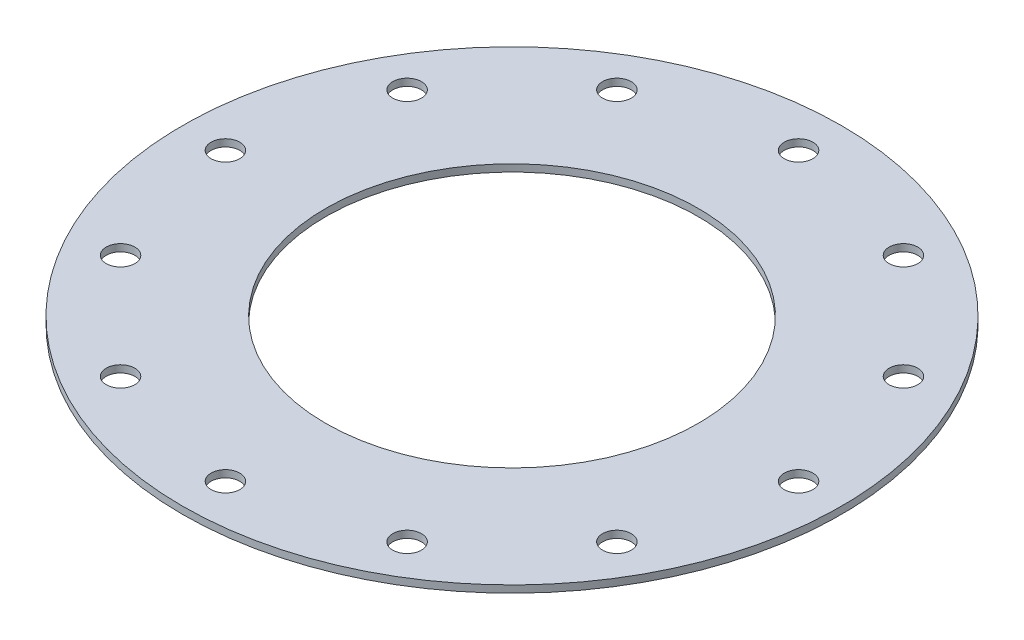
ISO-10303-21;
HEADER;
FILE_DESCRIPTION(('STEP AP214'),'2;1');
FILE_NAME('part.step','',(''),(''),'','','');
FILE_SCHEMA(('AUTOMOTIVE_DESIGN { 1 0 10303 214 1 1 1 1 }'));
ENDSEC;
DATA;
#1=APPLICATION_CONTEXT('core data for automotive mechanical design processes');
#2=APPLICATION_PROTOCOL_DEFINITION('international standard','automotive_design',2000,#1);
#3=PRODUCT_CONTEXT('',#1,'mechanical');
#4=PRODUCT('Part','Part','',(#3));
#5=PRODUCT_RELATED_PRODUCT_CATEGORY('part','',(#4));
#6=PRODUCT_DEFINITION_FORMATION('','',#4);
#7=PRODUCT_DEFINITION_CONTEXT('part definition',#1,'design');
#8=PRODUCT_DEFINITION('design','',#6,#7);
#9=PRODUCT_DEFINITION_SHAPE('','',#8);
#10=(LENGTH_UNIT() NAMED_UNIT(*) SI_UNIT(.MILLI.,.METRE.));
#11=(NAMED_UNIT(*) PLANE_ANGLE_UNIT() SI_UNIT($,.RADIAN.));
#12=(NAMED_UNIT(*) SI_UNIT($,.STERADIAN.) SOLID_ANGLE_UNIT());
#13=UNCERTAINTY_MEASURE_WITH_UNIT(LENGTH_MEASURE(1.E-05),#10,'distance_accuracy_value','');
#14=(GEOMETRIC_REPRESENTATION_CONTEXT(3) GLOBAL_UNCERTAINTY_ASSIGNED_CONTEXT((#13)) GLOBAL_UNIT_ASSIGNED_CONTEXT((#10,
#11,#12)) REPRESENTATION_CONTEXT('',''));
#15=CARTESIAN_POINT('',(0.,0.,0.));
#16=DIRECTION('',(0.,0.,1.));
#17=DIRECTION('',(1.,0.,0.));
#18=AXIS2_PLACEMENT_3D('',#15,#16,#17);
#19=CARTESIAN_POINT('',(0.,2.5,0.));
#20=DIRECTION('',(0.,1.,0.));
#21=DIRECTION('',(0.,0.,1.));
#22=AXIS2_PLACEMENT_3D('',#19,#20,#21);
#23=PLANE('',#22);
#24=CARTESIAN_POINT('',(-86.6025403784418,2.5,-49.9999999999963));
#25=DIRECTION('',(0.,1.,0.));
#26=DIRECTION('',(0.,0.,1.));
#27=AXIS2_PLACEMENT_3D('',#24,#25,#26);
#28=CIRCLE('',#27,5.0000000000043);
#29=CARTESIAN_POINT('',(-86.6025403784418,2.5,-44.9999999999919));
#30=VERTEX_POINT('',#29);
#31=EDGE_CURVE('E107',#30,#30,#28,.T.);
#32=ORIENTED_EDGE('',*,*,#31,.F.);
#33=EDGE_LOOP('',(#32));
#34=FACE_BOUND('',#33,.T.);
#35=CARTESIAN_POINT('',(-86.6025403784375,2.5,50.0000000000037));
#36=DIRECTION('',(0.,1.,0.));
#37=DIRECTION('',(0.,0.,1.));
#38=AXIS2_PLACEMENT_3D('',#35,#36,#37);
#39=CIRCLE('',#38,5.00000000000811);
#40=CARTESIAN_POINT('',(-86.6025403784375,2.5,55.0000000000118));
#41=VERTEX_POINT('',#40);
#42=EDGE_CURVE('E95',#41,#41,#39,.T.);
#43=ORIENTED_EDGE('',*,*,#42,.F.);
#44=EDGE_LOOP('',(#43));
#45=FACE_BOUND('',#44,.T.);
#46=CARTESIAN_POINT('',(8.50201989313826E-12,2.5,100.));
#47=DIRECTION('',(0.,1.,0.));
#48=DIRECTION('',(0.,0.,1.));
#49=AXIS2_PLACEMENT_3D('',#46,#47,#48);
#50=CIRCLE('',#49,5.0000000000088);
#51=CARTESIAN_POINT('',(8.50201989313826E-12,2.5,105.000000000009));
#52=VERTEX_POINT('',#51);
#53=EDGE_CURVE('E83',#52,#52,#50,.T.);
#54=ORIENTED_EDGE('',*,*,#53,.F.);
#55=EDGE_LOOP('',(#54));
#56=FACE_BOUND('',#55,.T.);
#57=CARTESIAN_POINT('',(86.6025403784503,2.5,49.9999999999963));
#58=DIRECTION('',(0.,1.,0.));
#59=DIRECTION('',(0.,0.,1.));
#60=AXIS2_PLACEMENT_3D('',#57,#58,#59);
#61=CIRCLE('',#60,5.00000000000549);
#62=CARTESIAN_POINT('',(86.6025403784503,2.5,55.0000000000018));
#63=VERTEX_POINT('',#62);
#64=EDGE_CURVE('E71',#63,#63,#61,.T.);
#65=ORIENTED_EDGE('',*,*,#64,.F.);
#66=EDGE_LOOP('',(#65));
#67=FACE_BOUND('',#66,.T.);
#68=CARTESIAN_POINT('',(86.602540378446,2.5,-50.0000000000037));
#69=DIRECTION('',(0.,1.,0.));
#70=DIRECTION('',(0.,0.,1.));
#71=AXIS2_PLACEMENT_3D('',#68,#69,#70);
#72=CIRCLE('',#71,5.00000000000119);
#73=CARTESIAN_POINT('',(86.602540378446,2.5,-45.0000000000025));
#74=VERTEX_POINT('',#73);
#75=EDGE_CURVE('E59',#74,#74,#72,.T.);
#76=ORIENTED_EDGE('',*,*,#75,.F.);
#77=EDGE_LOOP('',(#76));
#78=FACE_BOUND('',#77,.T.);
#79=CARTESIAN_POINT('',(0.,2.5,0.));
#80=DIRECTION('',(0.,1.,0.));
#81=DIRECTION('',(0.,0.,1.));
#82=AXIS2_PLACEMENT_3D('',#79,#80,#81);
#83=CIRCLE('',#82,65.);
#84=CARTESIAN_POINT('',(0.,2.5,65.));
#85=VERTEX_POINT('',#84);
#86=EDGE_CURVE('E47',#85,#85,#83,.T.);
#87=ORIENTED_EDGE('',*,*,#86,.F.);
#88=EDGE_LOOP('',(#87));
#89=FACE_BOUND('',#88,.T.);
#90=CARTESIAN_POINT('',(0.,2.5,0.));
#91=DIRECTION('',(0.,1.,0.));
#92=DIRECTION('',(0.,0.,1.));
#93=AXIS2_PLACEMENT_3D('',#90,#91,#92);
#94=CIRCLE('',#93,115.);
#95=CARTESIAN_POINT('',(0.,2.5,115.));
#96=VERTEX_POINT('',#95);
#97=EDGE_CURVE('E10',#96,#96,#94,.T.);
#98=ORIENTED_EDGE('',*,*,#97,.T.);
#99=EDGE_LOOP('',(#98));
#100=FACE_BOUND('',#99,.T.);
#101=CARTESIAN_POINT('',(0.,2.5,-100.));
#102=DIRECTION('',(0.,1.,0.));
#103=DIRECTION('',(0.,0.,1.));
#104=AXIS2_PLACEMENT_3D('',#101,#102,#103);
#105=CIRCLE('',#104,5.);
#106=CARTESIAN_POINT('',(0.,2.5,-95.));
#107=VERTEX_POINT('',#106);
#108=EDGE_CURVE('E42',#107,#107,#105,.T.);
#109=ORIENTED_EDGE('',*,*,#108,.F.);
#110=EDGE_LOOP('',(#109));
#111=FACE_BOUND('',#110,.T.);
#112=CARTESIAN_POINT('',(50.0000000000001,2.5,-86.6025403784438));
#113=DIRECTION('',(0.,1.,0.));
#114=DIRECTION('',(0.,0.,1.));
#115=AXIS2_PLACEMENT_3D('',#112,#113,#114);
#116=CIRCLE('',#115,5.00000000000001);
#117=CARTESIAN_POINT('',(50.0000000000001,2.5,-81.6025403784438));
#118=VERTEX_POINT('',#117);
#119=EDGE_CURVE('E53',#118,#118,#116,.T.);
#120=ORIENTED_EDGE('',*,*,#119,.F.);
#121=EDGE_LOOP('',(#120));
#122=FACE_BOUND('',#121,.T.);
#123=CARTESIAN_POINT('',(100.000000000004,2.5,-4.25100994656913E-12));
#124=DIRECTION('',(0.,1.,0.));
#125=DIRECTION('',(0.,0.,1.));
#126=AXIS2_PLACEMENT_3D('',#123,#124,#125);
#127=CIRCLE('',#126,5.00000000000316);
#128=CARTESIAN_POINT('',(100.000000000004,2.5,4.99999999999891));
#129=VERTEX_POINT('',#128);
#130=EDGE_CURVE('E65',#129,#129,#127,.T.);
#131=ORIENTED_EDGE('',*,*,#130,.F.);
#132=EDGE_LOOP('',(#131));
#133=FACE_BOUND('',#132,.T.);
#134=CARTESIAN_POINT('',(50.000000000008,2.5,86.6025403784417));
#135=DIRECTION('',(0.,1.,0.));
#136=DIRECTION('',(0.,0.,1.));
#137=AXIS2_PLACEMENT_3D('',#134,#135,#136);
#138=CIRCLE('',#137,5.00000000000758);
#139=CARTESIAN_POINT('',(50.000000000008,2.5,91.6025403784493));
#140=VERTEX_POINT('',#139);
#141=EDGE_CURVE('E77',#140,#140,#138,.T.);
#142=ORIENTED_EDGE('',*,*,#141,.F.);
#143=EDGE_LOOP('',(#142));
#144=FACE_BOUND('',#143,.T.);
#145=CARTESIAN_POINT('',(-49.999999999992,2.5,86.602540378446));
#146=DIRECTION('',(0.,1.,0.));
#147=DIRECTION('',(0.,0.,1.));
#148=AXIS2_PLACEMENT_3D('',#145,#146,#147);
#149=CIRCLE('',#148,5.00000000000902);
#150=CARTESIAN_POINT('',(-49.999999999992,2.5,91.602540378455));
#151=VERTEX_POINT('',#150);
#152=EDGE_CURVE('E89',#151,#151,#149,.T.);
#153=ORIENTED_EDGE('',*,*,#152,.F.);
#154=EDGE_LOOP('',(#153));
#155=FACE_BOUND('',#154,.T.);
#156=CARTESIAN_POINT('',(-99.9999999999958,2.5,4.2632564145606E-12));
#157=DIRECTION('',(0.,1.,0.));
#158=DIRECTION('',(0.,0.,1.));
#159=AXIS2_PLACEMENT_3D('',#156,#157,#158);
#160=CIRCLE('',#159,5.00000000000632);
#161=CARTESIAN_POINT('',(-99.9999999999958,2.5,5.00000000001058));
#162=VERTEX_POINT('',#161);
#163=EDGE_CURVE('E101',#162,#162,#160,.T.);
#164=ORIENTED_EDGE('',*,*,#163,.F.);
#165=EDGE_LOOP('',(#164));
#166=FACE_BOUND('',#165,.T.);
#167=CARTESIAN_POINT('',(-49.9999999999995,2.5,-86.6025403784417));
#168=DIRECTION('',(0.,1.,0.));
#169=DIRECTION('',(0.,0.,1.));
#170=AXIS2_PLACEMENT_3D('',#167,#168,#169);
#171=CIRCLE('',#170,5.00000000000245);
#172=CARTESIAN_POINT('',(-49.9999999999995,2.5,-81.6025403784393));
#173=VERTEX_POINT('',#172);
#174=EDGE_CURVE('E113',#173,#173,#171,.T.);
#175=ORIENTED_EDGE('',*,*,#174,.F.);
#176=EDGE_LOOP('',(#175));
#177=FACE_BOUND('',#176,.T.);
#178=ADVANCED_FACE('F31',(#34,#45,#56,#67,#78,#89,#100,#111,#122,#133,#144,#155,#166,#177),#23,.T.);
#179=CARTESIAN_POINT('',(0.,0.,0.));
#180=DIRECTION('',(0.,1.,0.));
#181=DIRECTION('',(0.,0.,1.));
#182=AXIS2_PLACEMENT_3D('',#179,#180,#181);
#183=PLANE('',#182);
#184=CARTESIAN_POINT('',(0.,0.,0.));
#185=DIRECTION('',(0.,1.,0.));
#186=DIRECTION('',(0.,0.,1.));
#187=AXIS2_PLACEMENT_3D('',#184,#185,#186);
#188=CIRCLE('',#187,115.);
#189=CARTESIAN_POINT('',(0.,0.,115.));
#190=VERTEX_POINT('',#189);
#191=EDGE_CURVE('E35',#190,#190,#188,.T.);
#192=ORIENTED_EDGE('',*,*,#191,.F.);
#193=EDGE_LOOP('',(#192));
#194=FACE_BOUND('',#193,.T.);
#195=CARTESIAN_POINT('',(0.,0.,-100.));
#196=DIRECTION('',(0.,1.,0.));
#197=DIRECTION('',(0.,0.,1.));
#198=AXIS2_PLACEMENT_3D('',#195,#196,#197);
#199=CIRCLE('',#198,5.);
#200=CARTESIAN_POINT('',(0.,0.,-95.));
#201=VERTEX_POINT('',#200);
#202=EDGE_CURVE('E44',#201,#201,#199,.T.);
#203=ORIENTED_EDGE('',*,*,#202,.T.);
#204=EDGE_LOOP('',(#203));
#205=FACE_BOUND('',#204,.T.);
#206=CARTESIAN_POINT('',(0.,0.,0.));
#207=DIRECTION('',(0.,1.,0.));
#208=DIRECTION('',(0.,0.,1.));
#209=AXIS2_PLACEMENT_3D('',#206,#207,#208);
#210=CIRCLE('',#209,65.);
#211=CARTESIAN_POINT('',(0.,0.,65.));
#212=VERTEX_POINT('',#211);
#213=EDGE_CURVE('E50',#212,#212,#210,.T.);
#214=ORIENTED_EDGE('',*,*,#213,.T.);
#215=EDGE_LOOP('',(#214));
#216=FACE_BOUND('',#215,.T.);
#217=CARTESIAN_POINT('',(50.0000000000001,0.,-86.6025403784438));
#218=DIRECTION('',(0.,1.,0.));
#219=DIRECTION('',(0.,0.,1.));
#220=AXIS2_PLACEMENT_3D('',#217,#218,#219);
#221=CIRCLE('',#220,5.00000000000001);
#222=CARTESIAN_POINT('',(50.0000000000001,0.,-81.6025403784438));
#223=VERTEX_POINT('',#222);
#224=EDGE_CURVE('E56',#223,#223,#221,.T.);
#225=ORIENTED_EDGE('',*,*,#224,.T.);
#226=EDGE_LOOP('',(#225));
#227=FACE_BOUND('',#226,.T.);
#228=CARTESIAN_POINT('',(86.602540378446,0.,-50.0000000000037));
#229=DIRECTION('',(0.,1.,0.));
#230=DIRECTION('',(0.,0.,1.));
#231=AXIS2_PLACEMENT_3D('',#228,#229,#230);
#232=CIRCLE('',#231,5.00000000000119);
#233=CARTESIAN_POINT('',(86.602540378446,0.,-45.0000000000025));
#234=VERTEX_POINT('',#233);
#235=EDGE_CURVE('E62',#234,#234,#232,.T.);
#236=ORIENTED_EDGE('',*,*,#235,.T.);
#237=EDGE_LOOP('',(#236));
#238=FACE_BOUND('',#237,.T.);
#239=CARTESIAN_POINT('',(100.000000000004,0.,-4.25100994656913E-12));
#240=DIRECTION('',(0.,1.,0.));
#241=DIRECTION('',(0.,0.,1.));
#242=AXIS2_PLACEMENT_3D('',#239,#240,#241);
#243=CIRCLE('',#242,5.00000000000316);
#244=CARTESIAN_POINT('',(100.000000000004,0.,4.99999999999891));
#245=VERTEX_POINT('',#244);
#246=EDGE_CURVE('E68',#245,#245,#243,.T.);
#247=ORIENTED_EDGE('',*,*,#246,.T.);
#248=EDGE_LOOP('',(#247));
#249=FACE_BOUND('',#248,.T.);
#250=CARTESIAN_POINT('',(86.6025403784503,0.,49.9999999999963));
#251=DIRECTION('',(0.,1.,0.));
#252=DIRECTION('',(0.,0.,1.));
#253=AXIS2_PLACEMENT_3D('',#250,#251,#252);
#254=CIRCLE('',#253,5.00000000000549);
#255=CARTESIAN_POINT('',(86.6025403784503,0.,55.0000000000018));
#256=VERTEX_POINT('',#255);
#257=EDGE_CURVE('E74',#256,#256,#254,.T.);
#258=ORIENTED_EDGE('',*,*,#257,.T.);
#259=EDGE_LOOP('',(#258));
#260=FACE_BOUND('',#259,.T.);
#261=CARTESIAN_POINT('',(50.000000000008,0.,86.6025403784417));
#262=DIRECTION('',(0.,1.,0.));
#263=DIRECTION('',(0.,0.,1.));
#264=AXIS2_PLACEMENT_3D('',#261,#262,#263);
#265=CIRCLE('',#264,5.00000000000758);
#266=CARTESIAN_POINT('',(50.000000000008,0.,91.6025403784493));
#267=VERTEX_POINT('',#266);
#268=EDGE_CURVE('E80',#267,#267,#265,.T.);
#269=ORIENTED_EDGE('',*,*,#268,.T.);
#270=EDGE_LOOP('',(#269));
#271=FACE_BOUND('',#270,.T.);
#272=CARTESIAN_POINT('',(8.50201989313826E-12,0.,100.));
#273=DIRECTION('',(0.,1.,0.));
#274=DIRECTION('',(0.,0.,1.));
#275=AXIS2_PLACEMENT_3D('',#272,#273,#274);
#276=CIRCLE('',#275,5.0000000000088);
#277=CARTESIAN_POINT('',(8.50201989313826E-12,0.,105.000000000009));
#278=VERTEX_POINT('',#277);
#279=EDGE_CURVE('E86',#278,#278,#276,.T.);
#280=ORIENTED_EDGE('',*,*,#279,.T.);
#281=EDGE_LOOP('',(#280));
#282=FACE_BOUND('',#281,.T.);
#283=CARTESIAN_POINT('',(-49.999999999992,0.,86.602540378446));
#284=DIRECTION('',(0.,1.,0.));
#285=DIRECTION('',(0.,0.,1.));
#286=AXIS2_PLACEMENT_3D('',#283,#284,#285);
#287=CIRCLE('',#286,5.00000000000902);
#288=CARTESIAN_POINT('',(-49.999999999992,0.,91.602540378455));
#289=VERTEX_POINT('',#288);
#290=EDGE_CURVE('E92',#289,#289,#287,.T.);
#291=ORIENTED_EDGE('',*,*,#290,.T.);
#292=EDGE_LOOP('',(#291));
#293=FACE_BOUND('',#292,.T.);
#294=CARTESIAN_POINT('',(-86.6025403784375,0.,50.0000000000037));
#295=DIRECTION('',(0.,1.,0.));
#296=DIRECTION('',(0.,0.,1.));
#297=AXIS2_PLACEMENT_3D('',#294,#295,#296);
#298=CIRCLE('',#297,5.00000000000811);
#299=CARTESIAN_POINT('',(-86.6025403784375,0.,55.0000000000118));
#300=VERTEX_POINT('',#299);
#301=EDGE_CURVE('E98',#300,#300,#298,.T.);
#302=ORIENTED_EDGE('',*,*,#301,.T.);
#303=EDGE_LOOP('',(#302));
#304=FACE_BOUND('',#303,.T.);
#305=CARTESIAN_POINT('',(-99.9999999999958,0.,4.2632564145606E-12));
#306=DIRECTION('',(0.,1.,0.));
#307=DIRECTION('',(0.,0.,1.));
#308=AXIS2_PLACEMENT_3D('',#305,#306,#307);
#309=CIRCLE('',#308,5.00000000000632);
#310=CARTESIAN_POINT('',(-99.9999999999958,0.,5.00000000001058));
#311=VERTEX_POINT('',#310);
#312=EDGE_CURVE('E104',#311,#311,#309,.T.);
#313=ORIENTED_EDGE('',*,*,#312,.T.);
#314=EDGE_LOOP('',(#313));
#315=FACE_BOUND('',#314,.T.);
#316=CARTESIAN_POINT('',(-86.6025403784418,0.,-49.9999999999963));
#317=DIRECTION('',(0.,1.,0.));
#318=DIRECTION('',(0.,0.,1.));
#319=AXIS2_PLACEMENT_3D('',#316,#317,#318);
#320=CIRCLE('',#319,5.0000000000043);
#321=CARTESIAN_POINT('',(-86.6025403784418,0.,-44.9999999999919));
#322=VERTEX_POINT('',#321);
#323=EDGE_CURVE('E110',#322,#322,#320,.T.);
#324=ORIENTED_EDGE('',*,*,#323,.T.);
#325=EDGE_LOOP('',(#324));
#326=FACE_BOUND('',#325,.T.);
#327=CARTESIAN_POINT('',(-49.9999999999995,0.,-86.6025403784417));
#328=DIRECTION('',(0.,1.,0.));
#329=DIRECTION('',(0.,0.,1.));
#330=AXIS2_PLACEMENT_3D('',#327,#328,#329);
#331=CIRCLE('',#330,5.00000000000245);
#332=CARTESIAN_POINT('',(-49.9999999999995,0.,-81.6025403784393));
#333=VERTEX_POINT('',#332);
#334=EDGE_CURVE('E116',#333,#333,#331,.T.);
#335=ORIENTED_EDGE('',*,*,#334,.T.);
#336=EDGE_LOOP('',(#335));
#337=FACE_BOUND('',#336,.T.);
#338=ADVANCED_FACE('F126',(#194,#205,#216,#227,#238,#249,#260,#271,#282,#293,#304,#315,#326,
#337),#183,.F.);
#339=CARTESIAN_POINT('',(0.,2.5,0.));
#340=DIRECTION('',(0.,-1.,0.));
#341=DIRECTION('',(0.,0.,-1.));
#342=AXIS2_PLACEMENT_3D('',#339,#340,#341);
#343=CYLINDRICAL_SURFACE('',#342,115.);
#344=ORIENTED_EDGE('',*,*,#97,.F.);
#345=EDGE_LOOP('',(#344));
#346=FACE_BOUND('',#345,.T.);
#347=ORIENTED_EDGE('',*,*,#191,.T.);
#348=EDGE_LOOP('',(#347));
#349=FACE_BOUND('',#348,.T.);
#350=ADVANCED_FACE('F33',(#346,#349),#343,.T.);
#351=CARTESIAN_POINT('',(0.,2.5,-100.));
#352=DIRECTION('',(0.,-1.,0.));
#353=DIRECTION('',(0.,0.,-1.));
#354=AXIS2_PLACEMENT_3D('',#351,#352,#353);
#355=CYLINDRICAL_SURFACE('',#354,5.);
#356=ORIENTED_EDGE('',*,*,#108,.T.);
#357=EDGE_LOOP('',(#356));
#358=FACE_BOUND('',#357,.T.);
#359=ORIENTED_EDGE('',*,*,#202,.F.);
#360=EDGE_LOOP('',(#359));
#361=FACE_BOUND('',#360,.T.);
#362=ADVANCED_FACE('F136',(#358,#361),#355,.F.);
#363=CARTESIAN_POINT('',(0.,2.5,0.));
#364=DIRECTION('',(0.,-1.,0.));
#365=DIRECTION('',(0.,0.,-1.));
#366=AXIS2_PLACEMENT_3D('',#363,#364,#365);
#367=CYLINDRICAL_SURFACE('',#366,65.);
#368=ORIENTED_EDGE('',*,*,#86,.T.);
#369=EDGE_LOOP('',(#368));
#370=FACE_BOUND('',#369,.T.);
#371=ORIENTED_EDGE('',*,*,#213,.F.);
#372=EDGE_LOOP('',(#371));
#373=FACE_BOUND('',#372,.T.);
#374=ADVANCED_FACE('F139',(#370,#373),#367,.F.);
#375=CARTESIAN_POINT('',(50.0000000000001,2.5,-86.6025403784438));
#376=DIRECTION('',(0.,-1.,0.));
#377=DIRECTION('',(0.,0.,-1.));
#378=AXIS2_PLACEMENT_3D('',#375,#376,#377);
#379=CYLINDRICAL_SURFACE('',#378,5.00000000000001);
#380=ORIENTED_EDGE('',*,*,#119,.T.);
#381=EDGE_LOOP('',(#380));
#382=FACE_BOUND('',#381,.T.);
#383=ORIENTED_EDGE('',*,*,#224,.F.);
#384=EDGE_LOOP('',(#383));
#385=FACE_BOUND('',#384,.T.);
#386=ADVANCED_FACE('F143',(#382,#385),#379,.F.);
#387=CARTESIAN_POINT('',(86.602540378446,2.5,-50.0000000000037));
#388=DIRECTION('',(0.,-1.,0.));
#389=DIRECTION('',(0.,0.,-1.));
#390=AXIS2_PLACEMENT_3D('',#387,#388,#389);
#391=CYLINDRICAL_SURFACE('',#390,5.00000000000119);
#392=ORIENTED_EDGE('',*,*,#75,.T.);
#393=EDGE_LOOP('',(#392));
#394=FACE_BOUND('',#393,.T.);
#395=ORIENTED_EDGE('',*,*,#235,.F.);
#396=EDGE_LOOP('',(#395));
#397=FACE_BOUND('',#396,.T.);
#398=ADVANCED_FACE('F147',(#394,#397),#391,.F.);
#399=CARTESIAN_POINT('',(100.000000000004,2.5,-4.25100994656913E-12));
#400=DIRECTION('',(0.,-1.,0.));
#401=DIRECTION('',(0.,0.,-1.));
#402=AXIS2_PLACEMENT_3D('',#399,#400,#401);
#403=CYLINDRICAL_SURFACE('',#402,5.00000000000316);
#404=ORIENTED_EDGE('',*,*,#130,.T.);
#405=EDGE_LOOP('',(#404));
#406=FACE_BOUND('',#405,.T.);
#407=ORIENTED_EDGE('',*,*,#246,.F.);
#408=EDGE_LOOP('',(#407));
#409=FACE_BOUND('',#408,.T.);
#410=ADVANCED_FACE('F151',(#406,#409),#403,.F.);
#411=CARTESIAN_POINT('',(86.6025403784503,2.5,49.9999999999963));
#412=DIRECTION('',(0.,-1.,0.));
#413=DIRECTION('',(0.,0.,-1.));
#414=AXIS2_PLACEMENT_3D('',#411,#412,#413);
#415=CYLINDRICAL_SURFACE('',#414,5.00000000000549);
#416=ORIENTED_EDGE('',*,*,#64,.T.);
#417=EDGE_LOOP('',(#416));
#418=FACE_BOUND('',#417,.T.);
#419=ORIENTED_EDGE('',*,*,#257,.F.);
#420=EDGE_LOOP('',(#419));
#421=FACE_BOUND('',#420,.T.);
#422=ADVANCED_FACE('F155',(#418,#421),#415,.F.);
#423=CARTESIAN_POINT('',(50.000000000008,2.5,86.6025403784417));
#424=DIRECTION('',(0.,-1.,0.));
#425=DIRECTION('',(0.,0.,-1.));
#426=AXIS2_PLACEMENT_3D('',#423,#424,#425);
#427=CYLINDRICAL_SURFACE('',#426,5.00000000000758);
#428=ORIENTED_EDGE('',*,*,#141,.T.);
#429=EDGE_LOOP('',(#428));
#430=FACE_BOUND('',#429,.T.);
#431=ORIENTED_EDGE('',*,*,#268,.F.);
#432=EDGE_LOOP('',(#431));
#433=FACE_BOUND('',#432,.T.);
#434=ADVANCED_FACE('F159',(#430,#433),#427,.F.);
#435=CARTESIAN_POINT('',(8.50201989313826E-12,2.5,100.));
#436=DIRECTION('',(0.,-1.,0.));
#437=DIRECTION('',(0.,0.,-1.));
#438=AXIS2_PLACEMENT_3D('',#435,#436,#437);
#439=CYLINDRICAL_SURFACE('',#438,5.0000000000088);
#440=ORIENTED_EDGE('',*,*,#53,.T.);
#441=EDGE_LOOP('',(#440));
#442=FACE_BOUND('',#441,.T.);
#443=ORIENTED_EDGE('',*,*,#279,.F.);
#444=EDGE_LOOP('',(#443));
#445=FACE_BOUND('',#444,.T.);
#446=ADVANCED_FACE('F163',(#442,#445),#439,.F.);
#447=CARTESIAN_POINT('',(-49.999999999992,2.5,86.602540378446));
#448=DIRECTION('',(0.,-1.,0.));
#449=DIRECTION('',(0.,0.,-1.));
#450=AXIS2_PLACEMENT_3D('',#447,#448,#449);
#451=CYLINDRICAL_SURFACE('',#450,5.00000000000902);
#452=ORIENTED_EDGE('',*,*,#152,.T.);
#453=EDGE_LOOP('',(#452));
#454=FACE_BOUND('',#453,.T.);
#455=ORIENTED_EDGE('',*,*,#290,.F.);
#456=EDGE_LOOP('',(#455));
#457=FACE_BOUND('',#456,.T.);
#458=ADVANCED_FACE('F167',(#454,#457),#451,.F.);
#459=CARTESIAN_POINT('',(-86.6025403784375,2.5,50.0000000000037));
#460=DIRECTION('',(0.,-1.,0.));
#461=DIRECTION('',(0.,0.,-1.));
#462=AXIS2_PLACEMENT_3D('',#459,#460,#461);
#463=CYLINDRICAL_SURFACE('',#462,5.00000000000811);
#464=ORIENTED_EDGE('',*,*,#42,.T.);
#465=EDGE_LOOP('',(#464));
#466=FACE_BOUND('',#465,.T.);
#467=ORIENTED_EDGE('',*,*,#301,.F.);
#468=EDGE_LOOP('',(#467));
#469=FACE_BOUND('',#468,.T.);
#470=ADVANCED_FACE('F171',(#466,#469),#463,.F.);
#471=CARTESIAN_POINT('',(-99.9999999999958,2.5,4.2632564145606E-12));
#472=DIRECTION('',(0.,-1.,0.));
#473=DIRECTION('',(0.,0.,-1.));
#474=AXIS2_PLACEMENT_3D('',#471,#472,#473);
#475=CYLINDRICAL_SURFACE('',#474,5.00000000000632);
#476=ORIENTED_EDGE('',*,*,#163,.T.);
#477=EDGE_LOOP('',(#476));
#478=FACE_BOUND('',#477,.T.);
#479=ORIENTED_EDGE('',*,*,#312,.F.);
#480=EDGE_LOOP('',(#479));
#481=FACE_BOUND('',#480,.T.);
#482=ADVANCED_FACE('F175',(#478,#481),#475,.F.);
#483=CARTESIAN_POINT('',(-86.6025403784418,2.5,-49.9999999999963));
#484=DIRECTION('',(0.,-1.,0.));
#485=DIRECTION('',(0.,0.,-1.));
#486=AXIS2_PLACEMENT_3D('',#483,#484,#485);
#487=CYLINDRICAL_SURFACE('',#486,5.0000000000043);
#488=ORIENTED_EDGE('',*,*,#31,.T.);
#489=EDGE_LOOP('',(#488));
#490=FACE_BOUND('',#489,.T.);
#491=ORIENTED_EDGE('',*,*,#323,.F.);
#492=EDGE_LOOP('',(#491));
#493=FACE_BOUND('',#492,.T.);
#494=ADVANCED_FACE('F179',(#490,#493),#487,.F.);
#495=CARTESIAN_POINT('',(-49.9999999999995,2.5,-86.6025403784417));
#496=DIRECTION('',(0.,-1.,0.));
#497=DIRECTION('',(0.,0.,-1.));
#498=AXIS2_PLACEMENT_3D('',#495,#496,#497);
#499=CYLINDRICAL_SURFACE('',#498,5.00000000000245);
#500=ORIENTED_EDGE('',*,*,#174,.T.);
#501=EDGE_LOOP('',(#500));
#502=FACE_BOUND('',#501,.T.);
#503=ORIENTED_EDGE('',*,*,#334,.F.);
#504=EDGE_LOOP('',(#503));
#505=FACE_BOUND('',#504,.T.);
#506=ADVANCED_FACE('F122',(#502,#505),#499,.F.);
#507=CLOSED_SHELL('',(#178,#338,#350,#362,#374,#386,#398,#410,#422,#434,#446,#458,#470,#482,
#494,#506));
#508=MANIFOLD_SOLID_BREP('B2',#507);
#509=ADVANCED_BREP_SHAPE_REPRESENTATION('',(#18,#508),#14);
#510=SHAPE_DEFINITION_REPRESENTATION(#9,#509);
ENDSEC;
END-ISO-10303-21;
